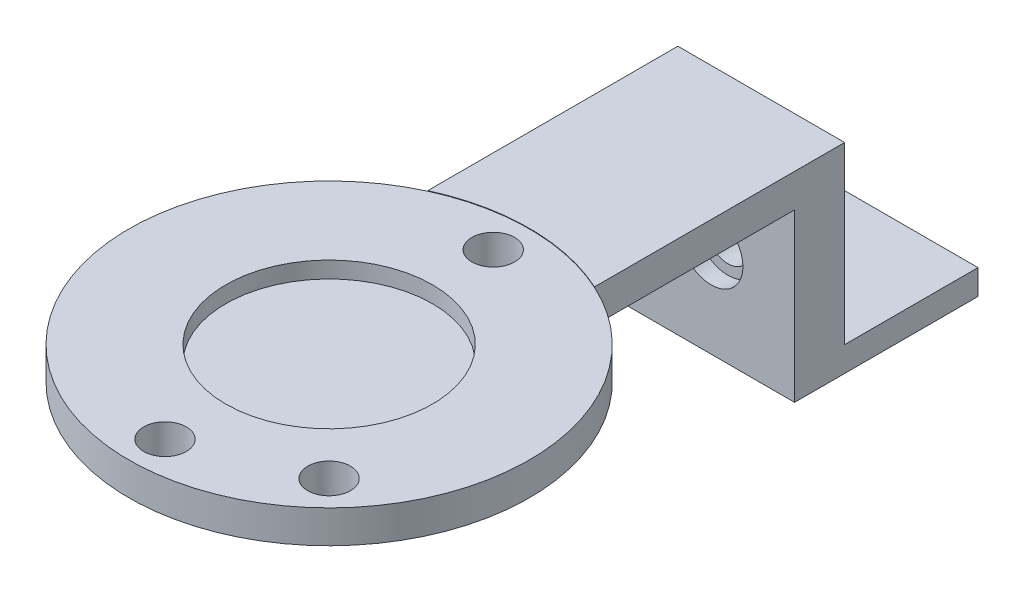
ISO-10303-21;
HEADER;
FILE_DESCRIPTION(('STEP AP214'),'2;1');
FILE_NAME('part.step','',(''),(''),'','','');
FILE_SCHEMA(('AUTOMOTIVE_DESIGN { 1 0 10303 214 1 1 1 1 }'));
ENDSEC;
DATA;
#1=APPLICATION_CONTEXT('core data for automotive mechanical design processes');
#2=APPLICATION_PROTOCOL_DEFINITION('international standard','automotive_design',2000,#1);
#3=PRODUCT_CONTEXT('',#1,'mechanical');
#4=PRODUCT('Part','Part','',(#3));
#5=PRODUCT_RELATED_PRODUCT_CATEGORY('part','',(#4));
#6=PRODUCT_DEFINITION_FORMATION('','',#4);
#7=PRODUCT_DEFINITION_CONTEXT('part definition',#1,'design');
#8=PRODUCT_DEFINITION('design','',#6,#7);
#9=PRODUCT_DEFINITION_SHAPE('','',#8);
#10=(LENGTH_UNIT() NAMED_UNIT(*) SI_UNIT(.MILLI.,.METRE.));
#11=(NAMED_UNIT(*) PLANE_ANGLE_UNIT() SI_UNIT($,.RADIAN.));
#12=(NAMED_UNIT(*) SI_UNIT($,.STERADIAN.) SOLID_ANGLE_UNIT());
#13=UNCERTAINTY_MEASURE_WITH_UNIT(LENGTH_MEASURE(1.E-05),#10,'distance_accuracy_value','');
#14=(GEOMETRIC_REPRESENTATION_CONTEXT(3) GLOBAL_UNCERTAINTY_ASSIGNED_CONTEXT((#13)) GLOBAL_UNIT_ASSIGNED_CONTEXT((#10,
#11,#12)) REPRESENTATION_CONTEXT('',''));
#15=CARTESIAN_POINT('',(0.,0.,0.));
#16=DIRECTION('',(0.,0.,1.));
#17=DIRECTION('',(1.,0.,0.));
#18=AXIS2_PLACEMENT_3D('',#15,#16,#17);
#19=CARTESIAN_POINT('',(0.,-11.43,-58.2101280198992));
#20=DIRECTION('',(0.,0.,-1.));
#21=DIRECTION('',(-1.,0.,0.));
#22=AXIS2_PLACEMENT_3D('',#19,#20,#21);
#23=CYLINDRICAL_SURFACE('',#22,3.302);
#24=CARTESIAN_POINT('',(0.,-11.43,-65.8301280198992));
#25=DIRECTION('',(0.,0.,-1.));
#26=DIRECTION('',(-1.,0.,0.));
#27=AXIS2_PLACEMENT_3D('',#24,#25,#26);
#28=CIRCLE('',#27,3.302);
#29=CARTESIAN_POINT('',(-3.302,-11.43,-65.8301280198992));
#30=VERTEX_POINT('',#29);
#31=EDGE_CURVE('E406',#30,#30,#28,.T.);
#32=CARTESIAN_POINT('',(0.,-11.43,-60.7501280198992));
#33=DIRECTION('',(0.,0.,1.));
#34=DIRECTION('',(1.,0.,0.));
#35=AXIS2_PLACEMENT_3D('',#32,#33,#34);
#36=CIRCLE('',#35,3.302);
#37=CARTESIAN_POINT('',(-3.302,-11.43,-60.7501280198992));
#38=VERTEX_POINT('',#37);
#39=EDGE_CURVE('E48',#38,#38,#36,.F.);
#40=CARTESIAN_POINT('',(-3.302,-11.43,-65.8301280198992));
#41=CARTESIAN_POINT('',(-3.302,-11.43,-65.7772113532326));
#42=CARTESIAN_POINT('',(-3.302,-11.43,-65.7242946865659));
#43=CARTESIAN_POINT('',(-3.302,-11.43,-65.6184613532326));
#44=CARTESIAN_POINT('',(-3.302,-11.43,-65.5655446865659));
#45=CARTESIAN_POINT('',(-3.302,-11.43,-65.4597113532325));
#46=CARTESIAN_POINT('',(-3.302,-11.43,-65.4067946865659));
#47=CARTESIAN_POINT('',(-3.302,-11.43,-65.3009613532326));
#48=CARTESIAN_POINT('',(-3.302,-11.43,-65.2480446865659));
#49=CARTESIAN_POINT('',(-3.302,-11.43,-65.1422113532325));
#50=CARTESIAN_POINT('',(-3.302,-11.43,-65.0892946865659));
#51=CARTESIAN_POINT('',(-3.302,-11.43,-64.9834613532325));
#52=CARTESIAN_POINT('',(-3.302,-11.43,-64.9305446865659));
#53=CARTESIAN_POINT('',(-3.302,-11.43,-64.8247113532325));
#54=CARTESIAN_POINT('',(-3.302,-11.43,-64.7717946865659));
#55=CARTESIAN_POINT('',(-3.302,-11.43,-64.6659613532325));
#56=CARTESIAN_POINT('',(-3.302,-11.43,-64.6130446865659));
#57=CARTESIAN_POINT('',(-3.302,-11.43,-64.5072113532325));
#58=CARTESIAN_POINT('',(-3.302,-11.43,-64.4542946865659));
#59=CARTESIAN_POINT('',(-3.302,-11.43,-64.3484613532326));
#60=CARTESIAN_POINT('',(-3.302,-11.43,-64.2955446865659));
#61=CARTESIAN_POINT('',(-3.302,-11.43,-64.1897113532326));
#62=CARTESIAN_POINT('',(-3.302,-11.43,-64.1367946865659));
#63=CARTESIAN_POINT('',(-3.302,-11.43,-64.0309613532326));
#64=CARTESIAN_POINT('',(-3.302,-11.43,-63.9780446865659));
#65=CARTESIAN_POINT('',(-3.302,-11.43,-63.8722113532326));
#66=CARTESIAN_POINT('',(-3.302,-11.43,-63.8192946865659));
#67=CARTESIAN_POINT('',(-3.302,-11.43,-63.7134613532326));
#68=CARTESIAN_POINT('',(-3.302,-11.43,-63.6605446865659));
#69=CARTESIAN_POINT('',(-3.302,-11.43,-63.5547113532326));
#70=CARTESIAN_POINT('',(-3.302,-11.43,-63.5017946865659));
#71=CARTESIAN_POINT('',(-3.302,-11.43,-63.3959613532326));
#72=CARTESIAN_POINT('',(-3.302,-11.43,-63.3430446865659));
#73=CARTESIAN_POINT('',(-3.302,-11.43,-63.2372113532326));
#74=CARTESIAN_POINT('',(-3.302,-11.43,-63.1842946865659));
#75=CARTESIAN_POINT('',(-3.302,-11.43,-63.0784613532326));
#76=CARTESIAN_POINT('',(-3.302,-11.43,-63.0255446865659));
#77=CARTESIAN_POINT('',(-3.302,-11.43,-62.9197113532326));
#78=CARTESIAN_POINT('',(-3.302,-11.43,-62.8667946865659));
#79=CARTESIAN_POINT('',(-3.302,-11.43,-62.7609613532326));
#80=CARTESIAN_POINT('',(-3.302,-11.43,-62.7080446865659));
#81=CARTESIAN_POINT('',(-3.302,-11.43,-62.6022113532326));
#82=CARTESIAN_POINT('',(-3.302,-11.43,-62.5492946865659));
#83=CARTESIAN_POINT('',(-3.302,-11.43,-62.4434613532325));
#84=CARTESIAN_POINT('',(-3.302,-11.43,-62.3905446865659));
#85=CARTESIAN_POINT('',(-3.302,-11.43,-62.2847113532326));
#86=CARTESIAN_POINT('',(-3.302,-11.43,-62.2317946865659));
#87=CARTESIAN_POINT('',(-3.302,-11.43,-62.1259613532326));
#88=CARTESIAN_POINT('',(-3.302,-11.43,-62.0730446865659));
#89=CARTESIAN_POINT('',(-3.302,-11.43,-61.9672113532326));
#90=CARTESIAN_POINT('',(-3.302,-11.43,-61.9142946865659));
#91=CARTESIAN_POINT('',(-3.302,-11.43,-61.8084613532326));
#92=CARTESIAN_POINT('',(-3.302,-11.43,-61.7555446865659));
#93=CARTESIAN_POINT('',(-3.302,-11.43,-61.6497113532326));
#94=CARTESIAN_POINT('',(-3.302,-11.43,-61.5967946865659));
#95=CARTESIAN_POINT('',(-3.302,-11.43,-61.4909613532326));
#96=CARTESIAN_POINT('',(-3.302,-11.43,-61.4380446865659));
#97=CARTESIAN_POINT('',(-3.302,-11.43,-61.3322113532326));
#98=CARTESIAN_POINT('',(-3.302,-11.43,-61.2792946865659));
#99=CARTESIAN_POINT('',(-3.302,-11.43,-61.1734613532326));
#100=CARTESIAN_POINT('',(-3.302,-11.43,-61.1205446865659));
#101=CARTESIAN_POINT('',(-3.302,-11.43,-61.0147113532326));
#102=CARTESIAN_POINT('',(-3.302,-11.43,-60.9617946865659));
#103=CARTESIAN_POINT('',(-3.302,-11.43,-60.8559613532326));
#104=CARTESIAN_POINT('',(-3.302,-11.43,-60.8030446865659));
#105=CARTESIAN_POINT('',(-3.302,-11.43,-60.7501280198992));
#106=B_SPLINE_CURVE_WITH_KNOTS('',3,(#40,#41,#42,#43,#44,#45,#46,#47,#48,#49,#50,#51,#52,#53,
#54,#55,#56,#57,#58,#59,#60,#61,#62,#63,#64,#65,#66,#67,#68,#69,#70,#71,#72,#73,#74,#75,#76,#77,
#78,#79,#80,#81,#82,#83,#84,#85,#86,#87,#88,#89,#90,#91,#92,#93,#94,#95,#96,#97,#98,#99,#100,
#101,#102,#103,#104,#105),.UNSPECIFIED.,.F.,.F.,(4,2,2,2,2,2,2,2,2,2,2,2,2,2,2,2,2,2,2,2,2,2,2,
2,2,2,2,2,2,2,2,2,4),(0.,0.158749999999999,0.317500000000012,0.476250000000011,
0.635000000000011,0.79375000000001,0.952500000000009,1.11125000000001,1.27000000000001,
1.42875000000001,1.58750000000001,1.74625,1.905,2.06375,2.2225,2.38125,2.54,2.69875,2.8575,
3.01625,3.175,3.33375,3.4925,3.65125,3.81,3.96875,4.1275,4.28625,4.445,4.60375,4.7625,4.92125,
5.07999999999999),.UNSPECIFIED.);
#107=EDGE_CURVE('BSEAM44',#30,#38,#106,.T.);
#108=ORIENTED_EDGE('',*,*,#31,.T.);
#109=ORIENTED_EDGE('',*,*,#39,.F.);
#110=ORIENTED_EDGE('',*,*,#107,.T.);
#111=ORIENTED_EDGE('',*,*,#107,.F.);
#112=EDGE_LOOP('',(#108,#110,#109,#111));
#113=FACE_BOUND('',#112,.T.);
#114=ADVANCED_FACE('F44',(#113),#23,.F.);
#115=CARTESIAN_POINT('',(0.,0.,0.));
#116=DIRECTION('',(0.,1.,0.));
#117=DIRECTION('',(0.,0.,1.));
#118=AXIS2_PLACEMENT_3D('',#115,#116,#117);
#119=PLANE('',#118);
#120=CARTESIAN_POINT('',(0.,0.,0.));
#121=DIRECTION('',(0.,-1.,0.));
#122=DIRECTION('',(0.,0.,-1.));
#123=AXIS2_PLACEMENT_3D('',#120,#121,#122);
#124=CIRCLE('',#123,15.75);
#125=CARTESIAN_POINT('',(0.,0.,-15.75));
#126=VERTEX_POINT('',#125);
#127=EDGE_CURVE('E12',#126,#126,#124,.T.);
#128=ORIENTED_EDGE('',*,*,#127,.F.);
#129=EDGE_LOOP('',(#128));
#130=FACE_BOUND('',#129,.T.);
#131=CARTESIAN_POINT('',(0.,0.,-25.));
#132=DIRECTION('',(0.,-1.,0.));
#133=DIRECTION('',(0.,0.,-1.));
#134=AXIS2_PLACEMENT_3D('',#131,#132,#133);
#135=CIRCLE('',#134,3.25);
#136=CARTESIAN_POINT('',(0.,0.,-28.25));
#137=VERTEX_POINT('',#136);
#138=EDGE_CURVE('E197',#137,#137,#135,.T.);
#139=ORIENTED_EDGE('',*,*,#138,.F.);
#140=EDGE_LOOP('',(#139));
#141=FACE_BOUND('',#140,.T.);
#142=CARTESIAN_POINT('',(0.,0.,25.));
#143=DIRECTION('',(0.,-1.,0.));
#144=DIRECTION('',(0.,0.,-1.));
#145=AXIS2_PLACEMENT_3D('',#142,#143,#144);
#146=CIRCLE('',#145,3.25);
#147=CARTESIAN_POINT('',(0.,0.,21.75));
#148=VERTEX_POINT('',#147);
#149=EDGE_CURVE('E191',#148,#148,#146,.T.);
#150=ORIENTED_EDGE('',*,*,#149,.F.);
#151=EDGE_LOOP('',(#150));
#152=FACE_BOUND('',#151,.T.);
#153=CARTESIAN_POINT('',(17.6744764826842,0.,17.680862));
#154=DIRECTION('',(0.,-1.,0.));
#155=DIRECTION('',(0.,0.,-1.));
#156=AXIS2_PLACEMENT_3D('',#153,#154,#155);
#157=CIRCLE('',#156,3.25);
#158=CARTESIAN_POINT('',(17.6744764826842,0.,14.430862));
#159=VERTEX_POINT('',#158);
#160=EDGE_CURVE('E177',#159,#159,#157,.T.);
#161=ORIENTED_EDGE('',*,*,#160,.F.);
#162=EDGE_LOOP('',(#161));
#163=FACE_BOUND('',#162,.T.);
#164=DIRECTION('',(-1.,0.,0.));
#165=VECTOR('',#164,1.);
#166=CARTESIAN_POINT('',(12.7,0.,-58.2101280198992));
#167=LINE('',#166,#165);
#168=CARTESIAN_POINT('',(12.7,0.,-58.2101280198992));
#169=VERTEX_POINT('',#168);
#170=CARTESIAN_POINT('',(-12.7,0.,-58.2101280198992));
#171=VERTEX_POINT('',#170);
#172=EDGE_CURVE('E69',#169,#171,#167,.T.);
#173=ORIENTED_EDGE('',*,*,#172,.F.);
#174=DIRECTION('',(0.,0.,-1.));
#175=VECTOR('',#174,1.);
#176=CARTESIAN_POINT('',(12.7,0.,0.));
#177=LINE('',#176,#175);
#178=CARTESIAN_POINT('',(12.7,0.,-27.7301280198992));
#179=VERTEX_POINT('',#178);
#180=EDGE_CURVE('E161',#179,#169,#177,.T.);
#181=ORIENTED_EDGE('',*,*,#180,.F.);
#182=CARTESIAN_POINT('',(0.,0.,0.));
#183=DIRECTION('',(0.,1.,0.));
#184=DIRECTION('',(0.,0.,1.));
#185=AXIS2_PLACEMENT_3D('',#182,#183,#184);
#186=CIRCLE('',#185,30.5);
#187=CARTESIAN_POINT('',(-12.7,0.,-27.7301280198992));
#188=VERTEX_POINT('',#187);
#189=EDGE_CURVE('E210',#188,#179,#186,.T.);
#190=ORIENTED_EDGE('',*,*,#189,.F.);
#191=DIRECTION('',(0.,0.,-1.));
#192=VECTOR('',#191,1.);
#193=CARTESIAN_POINT('',(-12.7,0.,0.));
#194=LINE('',#193,#192);
#195=EDGE_CURVE('E165',#188,#171,#194,.T.);
#196=ORIENTED_EDGE('',*,*,#195,.T.);
#197=EDGE_LOOP('',(#173,#181,#190,#196));
#198=FACE_BOUND('',#197,.T.);
#199=ADVANCED_FACE('F236',(#130,#141,#152,#163,#198),#119,.F.);
#200=CARTESIAN_POINT('',(0.,5.,0.));
#201=DIRECTION('',(0.,-1.,0.));
#202=DIRECTION('',(0.,0.,-1.));
#203=AXIS2_PLACEMENT_3D('',#200,#201,#202);
#204=CYLINDRICAL_SURFACE('',#203,30.5);
#205=DIRECTION('',(0.,-1.,0.));
#206=VECTOR('',#205,1.);
#207=CARTESIAN_POINT('',(12.7,5.08,-27.7301280198992));
#208=LINE('',#207,#206);
#209=CARTESIAN_POINT('',(12.7,5.,-27.7301280198992));
#210=VERTEX_POINT('',#209);
#211=EDGE_CURVE('E172',#210,#179,#208,.T.);
#212=ORIENTED_EDGE('',*,*,#211,.F.);
#213=CARTESIAN_POINT('',(0.,5.,0.));
#214=DIRECTION('',(0.,1.,0.));
#215=DIRECTION('',(0.,0.,1.));
#216=AXIS2_PLACEMENT_3D('',#213,#214,#215);
#217=CIRCLE('',#216,30.5);
#218=CARTESIAN_POINT('',(-12.7,5.,-27.7301280198992));
#219=VERTEX_POINT('',#218);
#220=EDGE_CURVE('E214',#219,#210,#217,.T.);
#221=ORIENTED_EDGE('',*,*,#220,.F.);
#222=DIRECTION('',(0.,-1.,0.));
#223=VECTOR('',#222,1.);
#224=CARTESIAN_POINT('',(-12.7,5.08,-27.7301280198992));
#225=LINE('',#224,#223);
#226=EDGE_CURVE('E182',#219,#188,#225,.T.);
#227=ORIENTED_EDGE('',*,*,#226,.T.);
#228=ORIENTED_EDGE('',*,*,#189,.T.);
#229=EDGE_LOOP('',(#212,#221,#227,#228));
#230=FACE_BOUND('',#229,.T.);
#231=ADVANCED_FACE('F46',(#230),#204,.T.);
#232=CARTESIAN_POINT('',(0.,5.,0.));
#233=DIRECTION('',(0.,1.,0.));
#234=DIRECTION('',(0.,0.,1.));
#235=AXIS2_PLACEMENT_3D('',#232,#233,#234);
#236=PLANE('',#235);
#237=CARTESIAN_POINT('',(17.6744764826842,5.,17.680862));
#238=DIRECTION('',(0.,1.,0.));
#239=DIRECTION('',(0.,0.,1.));
#240=AXIS2_PLACEMENT_3D('',#237,#238,#239);
#241=CIRCLE('',#240,3.25);
#242=CARTESIAN_POINT('',(17.6744764826842,5.,20.930862));
#243=VERTEX_POINT('',#242);
#244=EDGE_CURVE('E188',#243,#243,#241,.T.);
#245=ORIENTED_EDGE('',*,*,#244,.F.);
#246=EDGE_LOOP('',(#245));
#247=FACE_BOUND('',#246,.T.);
#248=CARTESIAN_POINT('',(0.,5.,25.));
#249=DIRECTION('',(0.,1.,0.));
#250=DIRECTION('',(0.,0.,1.));
#251=AXIS2_PLACEMENT_3D('',#248,#249,#250);
#252=CIRCLE('',#251,3.25);
#253=CARTESIAN_POINT('',(0.,5.,28.25));
#254=VERTEX_POINT('',#253);
#255=EDGE_CURVE('E194',#254,#254,#252,.T.);
#256=ORIENTED_EDGE('',*,*,#255,.F.);
#257=EDGE_LOOP('',(#256));
#258=FACE_BOUND('',#257,.T.);
#259=CARTESIAN_POINT('',(0.,5.,-25.));
#260=DIRECTION('',(0.,1.,0.));
#261=DIRECTION('',(0.,0.,1.));
#262=AXIS2_PLACEMENT_3D('',#259,#260,#261);
#263=CIRCLE('',#262,3.25);
#264=CARTESIAN_POINT('',(0.,5.,-21.75));
#265=VERTEX_POINT('',#264);
#266=EDGE_CURVE('E200',#265,#265,#263,.T.);
#267=ORIENTED_EDGE('',*,*,#266,.F.);
#268=EDGE_LOOP('',(#267));
#269=FACE_BOUND('',#268,.T.);
#270=CARTESIAN_POINT('',(0.,5.,0.));
#271=DIRECTION('',(0.,1.,0.));
#272=DIRECTION('',(0.,0.,1.));
#273=AXIS2_PLACEMENT_3D('',#270,#271,#272);
#274=CIRCLE('',#273,15.75);
#275=CARTESIAN_POINT('',(0.,5.,15.75));
#276=VERTEX_POINT('',#275);
#277=EDGE_CURVE('E205',#276,#276,#274,.T.);
#278=ORIENTED_EDGE('',*,*,#277,.F.);
#279=EDGE_LOOP('',(#278));
#280=FACE_BOUND('',#279,.T.);
#281=EDGE_CURVE('E53',#210,#219,#217,.T.);
#282=ORIENTED_EDGE('',*,*,#281,.T.);
#283=ORIENTED_EDGE('',*,*,#220,.T.);
#284=EDGE_LOOP('',(#282,#283));
#285=FACE_BOUND('',#284,.T.);
#286=ADVANCED_FACE('F221',(#247,#258,#269,#280,#285),#236,.T.);
#287=CARTESIAN_POINT('',(0.,2.5,0.));
#288=DIRECTION('',(0.,1.,0.));
#289=DIRECTION('',(0.,0.,1.));
#290=AXIS2_PLACEMENT_3D('',#287,#288,#289);
#291=CYLINDRICAL_SURFACE('',#290,15.75);
#292=CARTESIAN_POINT('',(0.,2.5,0.));
#293=DIRECTION('',(0.,1.,0.));
#294=DIRECTION('',(0.,0.,1.));
#295=AXIS2_PLACEMENT_3D('',#292,#293,#294);
#296=CIRCLE('',#295,15.75);
#297=CARTESIAN_POINT('',(0.,2.5,15.75));
#298=VERTEX_POINT('',#297);
#299=EDGE_CURVE('E207',#298,#298,#296,.T.);
#300=ORIENTED_EDGE('',*,*,#299,.F.);
#301=EDGE_LOOP('',(#300));
#302=FACE_BOUND('',#301,.T.);
#303=ORIENTED_EDGE('',*,*,#277,.T.);
#304=EDGE_LOOP('',(#303));
#305=FACE_BOUND('',#304,.T.);
#306=ADVANCED_FACE('F241',(#302,#305),#291,.F.);
#307=CARTESIAN_POINT('',(0.,2.5,0.));
#308=DIRECTION('',(0.,1.,0.));
#309=DIRECTION('',(0.,0.,1.));
#310=AXIS2_PLACEMENT_3D('',#307,#308,#309);
#311=PLANE('',#310);
#312=ORIENTED_EDGE('',*,*,#299,.T.);
#313=EDGE_LOOP('',(#312));
#314=FACE_BOUND('',#313,.T.);
#315=ADVANCED_FACE('F302',(#314),#311,.T.);
#316=CARTESIAN_POINT('',(0.,-2.5,0.));
#317=DIRECTION('',(0.,1.,0.));
#318=DIRECTION('',(0.,0.,1.));
#319=AXIS2_PLACEMENT_3D('',#316,#317,#318);
#320=CYLINDRICAL_SURFACE('',#319,15.75);
#321=CARTESIAN_POINT('',(0.,-2.5,0.));
#322=DIRECTION('',(0.,-1.,0.));
#323=DIRECTION('',(0.,0.,-1.));
#324=AXIS2_PLACEMENT_3D('',#321,#322,#323);
#325=CIRCLE('',#324,15.75);
#326=CARTESIAN_POINT('',(0.,-2.5,-15.75));
#327=VERTEX_POINT('',#326);
#328=EDGE_CURVE('E203',#327,#327,#325,.T.);
#329=ORIENTED_EDGE('',*,*,#328,.F.);
#330=EDGE_LOOP('',(#329));
#331=FACE_BOUND('',#330,.T.);
#332=ORIENTED_EDGE('',*,*,#127,.T.);
#333=EDGE_LOOP('',(#332));
#334=FACE_BOUND('',#333,.T.);
#335=ADVANCED_FACE('F298',(#331,#334),#320,.T.);
#336=CARTESIAN_POINT('',(0.,-2.5,0.));
#337=DIRECTION('',(0.,-1.,0.));
#338=DIRECTION('',(0.,0.,-1.));
#339=AXIS2_PLACEMENT_3D('',#336,#337,#338);
#340=PLANE('',#339);
#341=ORIENTED_EDGE('',*,*,#328,.T.);
#342=EDGE_LOOP('',(#341));
#343=FACE_BOUND('',#342,.T.);
#344=ADVANCED_FACE('F294',(#343),#340,.T.);
#345=CARTESIAN_POINT('',(0.,5.08,-25.));
#346=DIRECTION('',(0.,-1.,0.));
#347=DIRECTION('',(0.,0.,-1.));
#348=AXIS2_PLACEMENT_3D('',#345,#346,#347);
#349=CYLINDRICAL_SURFACE('',#348,3.25);
#350=ORIENTED_EDGE('',*,*,#266,.T.);
#351=EDGE_LOOP('',(#350));
#352=FACE_BOUND('',#351,.T.);
#353=ORIENTED_EDGE('',*,*,#138,.T.);
#354=EDGE_LOOP('',(#353));
#355=FACE_BOUND('',#354,.T.);
#356=ADVANCED_FACE('F290',(#352,#355),#349,.F.);
#357=CARTESIAN_POINT('',(0.,5.08,25.));
#358=DIRECTION('',(0.,-1.,0.));
#359=DIRECTION('',(0.,0.,-1.));
#360=AXIS2_PLACEMENT_3D('',#357,#358,#359);
#361=CYLINDRICAL_SURFACE('',#360,3.25);
#362=ORIENTED_EDGE('',*,*,#255,.T.);
#363=EDGE_LOOP('',(#362));
#364=FACE_BOUND('',#363,.T.);
#365=ORIENTED_EDGE('',*,*,#149,.T.);
#366=EDGE_LOOP('',(#365));
#367=FACE_BOUND('',#366,.T.);
#368=ADVANCED_FACE('F286',(#364,#367),#361,.F.);
#369=CARTESIAN_POINT('',(17.6744764826842,5.08,17.680862));
#370=DIRECTION('',(0.,-1.,0.));
#371=DIRECTION('',(0.,0.,-1.));
#372=AXIS2_PLACEMENT_3D('',#369,#370,#371);
#373=CYLINDRICAL_SURFACE('',#372,3.25);
#374=ORIENTED_EDGE('',*,*,#244,.T.);
#375=EDGE_LOOP('',(#374));
#376=FACE_BOUND('',#375,.T.);
#377=ORIENTED_EDGE('',*,*,#160,.T.);
#378=EDGE_LOOP('',(#377));
#379=FACE_BOUND('',#378,.T.);
#380=ADVANCED_FACE('F283',(#376,#379),#373,.F.);
#381=CARTESIAN_POINT('',(12.7,5.08,0.));
#382=DIRECTION('',(-1.,0.,0.));
#383=DIRECTION('',(0.,0.,1.));
#384=AXIS2_PLACEMENT_3D('',#381,#382,#383);
#385=PLANE('',#384);
#386=ORIENTED_EDGE('',*,*,#180,.T.);
#387=DIRECTION('',(0.,1.,0.));
#388=VECTOR('',#387,1.);
#389=CARTESIAN_POINT('',(12.7,-25.4,-58.2101280198992));
#390=LINE('',#389,#388);
#391=CARTESIAN_POINT('',(12.7,-25.4,-58.2101280198992));
#392=VERTEX_POINT('',#391);
#393=EDGE_CURVE('E158',#392,#169,#390,.T.);
#394=ORIENTED_EDGE('',*,*,#393,.F.);
#395=DIRECTION('',(0.,0.,1.));
#396=VECTOR('',#395,1.);
#397=CARTESIAN_POINT('',(12.7,-25.4,-65.8301280198992));
#398=LINE('',#397,#396);
#399=CARTESIAN_POINT('',(12.7,-25.4,-86.1501280198992));
#400=VERTEX_POINT('',#399);
#401=EDGE_CURVE('E144',#400,#392,#398,.T.);
#402=ORIENTED_EDGE('',*,*,#401,.F.);
#403=DIRECTION('',(0.,-1.,0.));
#404=VECTOR('',#403,1.);
#405=CARTESIAN_POINT('',(12.7,-25.4,-86.1501280198992));
#406=LINE('',#405,#404);
#407=CARTESIAN_POINT('',(12.7,-21.59,-86.1501280198992));
#408=VERTEX_POINT('',#407);
#409=EDGE_CURVE('E128',#408,#400,#406,.T.);
#410=ORIENTED_EDGE('',*,*,#409,.F.);
#411=DIRECTION('',(0.,0.,1.));
#412=VECTOR('',#411,1.);
#413=CARTESIAN_POINT('',(12.7,-21.59,-86.1501280198992));
#414=LINE('',#413,#412);
#415=CARTESIAN_POINT('',(12.7,-21.59,-65.8301280198992));
#416=VERTEX_POINT('',#415);
#417=EDGE_CURVE('E124',#408,#416,#414,.T.);
#418=ORIENTED_EDGE('',*,*,#417,.T.);
#419=DIRECTION('',(0.,-1.,0.));
#420=VECTOR('',#419,1.);
#421=CARTESIAN_POINT('',(12.7,5.08,-65.8301280198992));
#422=LINE('',#421,#420);
#423=CARTESIAN_POINT('',(12.7,5.08,-65.8301280198992));
#424=VERTEX_POINT('',#423);
#425=EDGE_CURVE('E175',#424,#416,#422,.T.);
#426=ORIENTED_EDGE('',*,*,#425,.F.);
#427=DIRECTION('',(0.,0.,-1.));
#428=VECTOR('',#427,1.);
#429=CARTESIAN_POINT('',(12.7,5.08,0.));
#430=LINE('',#429,#428);
#431=CARTESIAN_POINT('',(12.7,5.08,-27.7301280198992));
#432=VERTEX_POINT('',#431);
#433=EDGE_CURVE('E162',#432,#424,#430,.T.);
#434=ORIENTED_EDGE('',*,*,#433,.F.);
#435=EDGE_CURVE('E183',#432,#210,#208,.T.);
#436=ORIENTED_EDGE('',*,*,#435,.T.);
#437=ORIENTED_EDGE('',*,*,#211,.T.);
#438=EDGE_LOOP('',(#386,#394,#402,#410,#418,#426,#434,#436,#437));
#439=FACE_BOUND('',#438,.T.);
#440=ADVANCED_FACE('F229',(#439),#385,.F.);
#441=CARTESIAN_POINT('',(0.,5.08,-65.8301280198992));
#442=DIRECTION('',(0.,0.,-1.));
#443=DIRECTION('',(-1.,0.,0.));
#444=AXIS2_PLACEMENT_3D('',#441,#442,#443);
#445=PLANE('',#444);
#446=ORIENTED_EDGE('',*,*,#31,.F.);
#447=EDGE_LOOP('',(#446));
#448=FACE_BOUND('',#447,.T.);
#449=DIRECTION('',(1.,0.,0.));
#450=VECTOR('',#449,1.);
#451=CARTESIAN_POINT('',(-12.7,-21.59,-65.8301280198992));
#452=LINE('',#451,#450);
#453=CARTESIAN_POINT('',(-12.7,-21.59,-65.8301280198992));
#454=VERTEX_POINT('',#453);
#455=EDGE_CURVE('E61',#454,#416,#452,.T.);
#456=ORIENTED_EDGE('',*,*,#455,.F.);
#457=DIRECTION('',(0.,-1.,0.));
#458=VECTOR('',#457,1.);
#459=CARTESIAN_POINT('',(-12.7,5.08,-65.8301280198992));
#460=LINE('',#459,#458);
#461=CARTESIAN_POINT('',(-12.7,5.08,-65.8301280198992));
#462=VERTEX_POINT('',#461);
#463=EDGE_CURVE('E142',#462,#454,#460,.T.);
#464=ORIENTED_EDGE('',*,*,#463,.F.);
#465=DIRECTION('',(1.,0.,0.));
#466=VECTOR('',#465,1.);
#467=CARTESIAN_POINT('',(0.,5.08,-65.8301280198992));
#468=LINE('',#467,#466);
#469=EDGE_CURVE('E169',#462,#424,#468,.T.);
#470=ORIENTED_EDGE('',*,*,#469,.T.);
#471=ORIENTED_EDGE('',*,*,#425,.T.);
#472=EDGE_LOOP('',(#456,#464,#470,#471));
#473=FACE_BOUND('',#472,.T.);
#474=ADVANCED_FACE('F274',(#448,#473),#445,.T.);
#475=CARTESIAN_POINT('',(-12.7,5.08,0.));
#476=DIRECTION('',(-1.,0.,0.));
#477=DIRECTION('',(0.,0.,1.));
#478=AXIS2_PLACEMENT_3D('',#475,#476,#477);
#479=PLANE('',#478);
#480=ORIENTED_EDGE('',*,*,#195,.F.);
#481=ORIENTED_EDGE('',*,*,#226,.F.);
#482=CARTESIAN_POINT('',(-12.7,5.08,-27.7301280198992));
#483=VERTEX_POINT('',#482);
#484=EDGE_CURVE('E179',#483,#219,#225,.T.);
#485=ORIENTED_EDGE('',*,*,#484,.F.);
#486=DIRECTION('',(0.,0.,-1.));
#487=VECTOR('',#486,1.);
#488=CARTESIAN_POINT('',(-12.7,5.08,0.));
#489=LINE('',#488,#487);
#490=EDGE_CURVE('E167',#483,#462,#489,.T.);
#491=ORIENTED_EDGE('',*,*,#490,.T.);
#492=ORIENTED_EDGE('',*,*,#463,.T.);
#493=DIRECTION('',(0.,0.,1.));
#494=VECTOR('',#493,1.);
#495=CARTESIAN_POINT('',(-12.7,-21.59,-86.1501280198992));
#496=LINE('',#495,#494);
#497=CARTESIAN_POINT('',(-12.7,-21.59,-86.1501280198992));
#498=VERTEX_POINT('',#497);
#499=EDGE_CURVE('E122',#498,#454,#496,.T.);
#500=ORIENTED_EDGE('',*,*,#499,.F.);
#501=DIRECTION('',(0.,1.,0.));
#502=VECTOR('',#501,1.);
#503=CARTESIAN_POINT('',(-12.7,-25.4,-86.1501280198992));
#504=LINE('',#503,#502);
#505=CARTESIAN_POINT('',(-12.7,-25.4,-86.1501280198992));
#506=VERTEX_POINT('',#505);
#507=EDGE_CURVE('E129',#506,#498,#504,.T.);
#508=ORIENTED_EDGE('',*,*,#507,.F.);
#509=DIRECTION('',(0.,0.,-1.));
#510=VECTOR('',#509,1.);
#511=CARTESIAN_POINT('',(-12.7,-25.4,-65.8301280198992));
#512=LINE('',#511,#510);
#513=CARTESIAN_POINT('',(-12.7,-25.4,-58.2101280198992));
#514=VERTEX_POINT('',#513);
#515=EDGE_CURVE('E153',#514,#506,#512,.T.);
#516=ORIENTED_EDGE('',*,*,#515,.F.);
#517=DIRECTION('',(0.,1.,0.));
#518=VECTOR('',#517,1.);
#519=CARTESIAN_POINT('',(-12.7,-25.4,-58.2101280198992));
#520=LINE('',#519,#518);
#521=EDGE_CURVE('E154',#514,#171,#520,.T.);
#522=ORIENTED_EDGE('',*,*,#521,.T.);
#523=EDGE_LOOP('',(#480,#481,#485,#491,#492,#500,#508,#516,#522));
#524=FACE_BOUND('',#523,.T.);
#525=ADVANCED_FACE('F140',(#524),#479,.T.);
#526=CARTESIAN_POINT('',(0.,5.08,0.));
#527=DIRECTION('',(0.,-1.,0.));
#528=DIRECTION('',(0.,0.,-1.));
#529=AXIS2_PLACEMENT_3D('',#526,#527,#528);
#530=CYLINDRICAL_SURFACE('',#529,30.5);
#531=ORIENTED_EDGE('',*,*,#281,.F.);
#532=ORIENTED_EDGE('',*,*,#435,.F.);
#533=CARTESIAN_POINT('',(0.,5.08,0.));
#534=DIRECTION('',(0.,-1.,0.));
#535=DIRECTION('',(0.,0.,-1.));
#536=AXIS2_PLACEMENT_3D('',#533,#534,#535);
#537=CIRCLE('',#536,30.5);
#538=EDGE_CURVE('E164',#483,#432,#537,.T.);
#539=ORIENTED_EDGE('',*,*,#538,.F.);
#540=ORIENTED_EDGE('',*,*,#484,.T.);
#541=EDGE_LOOP('',(#531,#532,#539,#540));
#542=FACE_BOUND('',#541,.T.);
#543=ADVANCED_FACE('F225',(#542),#530,.F.);
#544=CARTESIAN_POINT('',(0.,5.08,0.));
#545=DIRECTION('',(0.,-1.,0.));
#546=DIRECTION('',(0.,0.,-1.));
#547=AXIS2_PLACEMENT_3D('',#544,#545,#546);
#548=PLANE('',#547);
#549=ORIENTED_EDGE('',*,*,#433,.T.);
#550=ORIENTED_EDGE('',*,*,#469,.F.);
#551=ORIENTED_EDGE('',*,*,#490,.F.);
#552=ORIENTED_EDGE('',*,*,#538,.T.);
#553=EDGE_LOOP('',(#549,#550,#551,#552));
#554=FACE_BOUND('',#553,.T.);
#555=ADVANCED_FACE('F233',(#554),#548,.F.);
#556=CARTESIAN_POINT('',(12.7,-25.4,-58.2101280198992));
#557=DIRECTION('',(0.,0.,-1.));
#558=DIRECTION('',(-1.,0.,0.));
#559=AXIS2_PLACEMENT_3D('',#556,#557,#558);
#560=PLANE('',#559);
#561=CARTESIAN_POINT('',(0.,-11.43,-58.2101280198992));
#562=DIRECTION('',(0.,0.,1.));
#563=DIRECTION('',(1.,0.,0.));
#564=AXIS2_PLACEMENT_3D('',#561,#562,#563);
#565=CIRCLE('',#564,4.826);
#566=CARTESIAN_POINT('',(4.826,-11.43,-58.2101280198992));
#567=VERTEX_POINT('',#566);
#568=EDGE_CURVE('E402',#567,#567,#565,.T.);
#569=ORIENTED_EDGE('',*,*,#568,.F.);
#570=EDGE_LOOP('',(#569));
#571=FACE_BOUND('',#570,.T.);
#572=ORIENTED_EDGE('',*,*,#172,.T.);
#573=ORIENTED_EDGE('',*,*,#521,.F.);
#574=DIRECTION('',(-1.,0.,0.));
#575=VECTOR('',#574,1.);
#576=CARTESIAN_POINT('',(12.7,-25.4,-58.2101280198992));
#577=LINE('',#576,#575);
#578=EDGE_CURVE('E151',#392,#514,#577,.T.);
#579=ORIENTED_EDGE('',*,*,#578,.F.);
#580=ORIENTED_EDGE('',*,*,#393,.T.);
#581=EDGE_LOOP('',(#572,#573,#579,#580));
#582=FACE_BOUND('',#581,.T.);
#583=ADVANCED_FACE('F267',(#571,#582),#560,.F.);
#584=CARTESIAN_POINT('',(0.,-25.4,0.));
#585=DIRECTION('',(0.,-1.,0.));
#586=DIRECTION('',(0.,0.,-1.));
#587=AXIS2_PLACEMENT_3D('',#584,#585,#586);
#588=PLANE('',#587);
#589=ORIENTED_EDGE('',*,*,#401,.T.);
#590=ORIENTED_EDGE('',*,*,#578,.T.);
#591=ORIENTED_EDGE('',*,*,#515,.T.);
#592=DIRECTION('',(-1.,0.,0.));
#593=VECTOR('',#592,1.);
#594=CARTESIAN_POINT('',(-12.7,-25.4,-86.1501280198992));
#595=LINE('',#594,#593);
#596=EDGE_CURVE('E135',#400,#506,#595,.T.);
#597=ORIENTED_EDGE('',*,*,#596,.F.);
#598=EDGE_LOOP('',(#589,#590,#591,#597));
#599=FACE_BOUND('',#598,.T.);
#600=ADVANCED_FACE('F264',(#599),#588,.T.);
#601=CARTESIAN_POINT('',(-12.7,-21.59,-86.1501280198992));
#602=DIRECTION('',(0.,-1.,0.));
#603=DIRECTION('',(1.,0.,0.));
#604=AXIS2_PLACEMENT_3D('',#601,#602,#603);
#605=PLANE('',#604);
#606=ORIENTED_EDGE('',*,*,#455,.T.);
#607=ORIENTED_EDGE('',*,*,#417,.F.);
#608=DIRECTION('',(1.,0.,0.));
#609=VECTOR('',#608,1.);
#610=CARTESIAN_POINT('',(-12.7,-21.59,-86.1501280198992));
#611=LINE('',#610,#609);
#612=EDGE_CURVE('E118',#498,#408,#611,.T.);
#613=ORIENTED_EDGE('',*,*,#612,.F.);
#614=ORIENTED_EDGE('',*,*,#499,.T.);
#615=EDGE_LOOP('',(#606,#607,#613,#614));
#616=FACE_BOUND('',#615,.T.);
#617=ADVANCED_FACE('F120',(#616),#605,.F.);
#618=CARTESIAN_POINT('',(0.,0.,-86.1501280198992));
#619=DIRECTION('',(0.,0.,-1.));
#620=DIRECTION('',(-1.,0.,0.));
#621=AXIS2_PLACEMENT_3D('',#618,#619,#620);
#622=PLANE('',#621);
#623=ORIENTED_EDGE('',*,*,#507,.T.);
#624=ORIENTED_EDGE('',*,*,#612,.T.);
#625=ORIENTED_EDGE('',*,*,#409,.T.);
#626=ORIENTED_EDGE('',*,*,#596,.T.);
#627=EDGE_LOOP('',(#623,#624,#625,#626));
#628=FACE_BOUND('',#627,.T.);
#629=ADVANCED_FACE('F133',(#628),#622,.T.);
#630=CARTESIAN_POINT('',(0.,-11.43,-60.7501280198992));
#631=DIRECTION('',(0.,0.,1.));
#632=DIRECTION('',(1.,0.,0.));
#633=AXIS2_PLACEMENT_3D('',#630,#631,#632);
#634=PLANE('',#633);
#635=CARTESIAN_POINT('',(0.,-11.43,-60.7501280198992));
#636=DIRECTION('',(0.,0.,1.));
#637=DIRECTION('',(1.,0.,0.));
#638=AXIS2_PLACEMENT_3D('',#635,#636,#637);
#639=CIRCLE('',#638,4.826);
#640=CARTESIAN_POINT('',(4.826,-11.43,-60.7501280198992));
#641=VERTEX_POINT('',#640);
#642=EDGE_CURVE('E399',#641,#641,#639,.T.);
#643=ORIENTED_EDGE('',*,*,#642,.T.);
#644=EDGE_LOOP('',(#643));
#645=FACE_BOUND('',#644,.T.);
#646=ORIENTED_EDGE('',*,*,#39,.T.);
#647=EDGE_LOOP('',(#646));
#648=FACE_BOUND('',#647,.T.);
#649=ADVANCED_FACE('F261',(#645,#648),#634,.T.);
#650=CARTESIAN_POINT('',(0.,-11.43,-60.7501280198992));
#651=DIRECTION('',(0.,0.,1.));
#652=DIRECTION('',(1.,0.,0.));
#653=AXIS2_PLACEMENT_3D('',#650,#651,#652);
#654=CYLINDRICAL_SURFACE('',#653,4.826);
#655=ORIENTED_EDGE('',*,*,#642,.F.);
#656=EDGE_LOOP('',(#655));
#657=FACE_BOUND('',#656,.T.);
#658=ORIENTED_EDGE('',*,*,#568,.T.);
#659=EDGE_LOOP('',(#658));
#660=FACE_BOUND('',#659,.T.);
#661=ADVANCED_FACE('F257',(#657,#660),#654,.F.);
#662=CLOSED_SHELL('',(#114,#199,#231,#286,#306,#315,#335,#344,#356,#368,#380,#440,#474,#525,
#543,#555,#583,#600,#617,#629,#649,#661));
#663=MANIFOLD_SOLID_BREP('B2',#662);
#664=ADVANCED_BREP_SHAPE_REPRESENTATION('',(#18,#663),#14);
#665=SHAPE_DEFINITION_REPRESENTATION(#9,#664);
ENDSEC;
END-ISO-10303-21;
